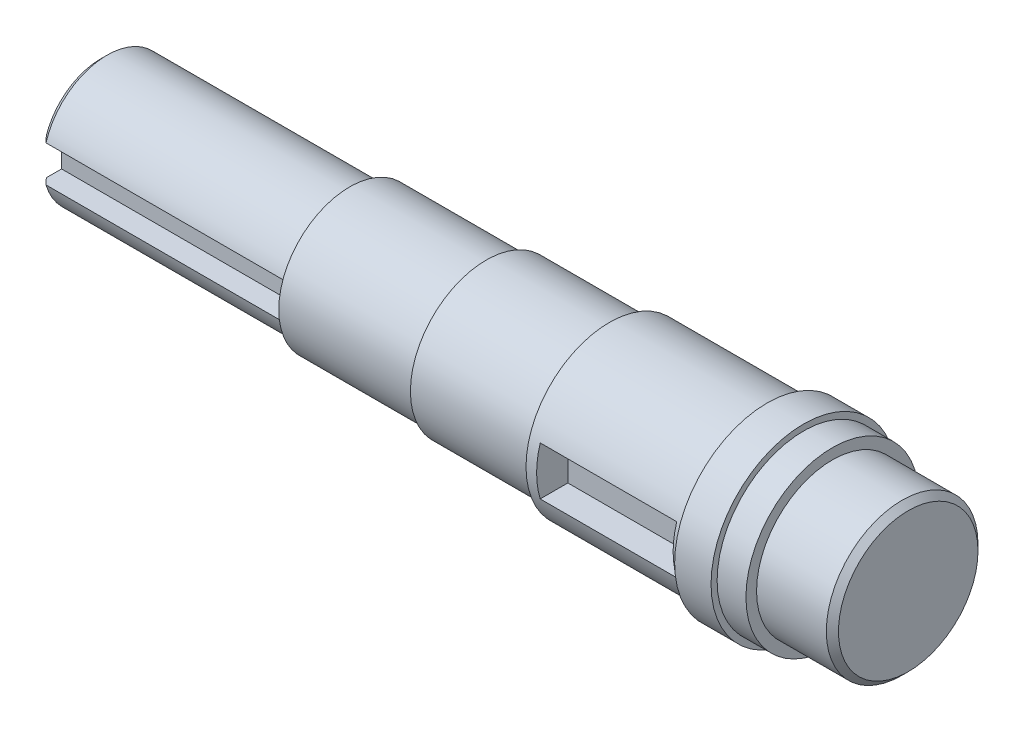
ISO-10303-21;
HEADER;
FILE_DESCRIPTION(('STEP AP214'),'2;1');
FILE_NAME('part.step','',(''),(''),'','','');
FILE_SCHEMA(('AUTOMOTIVE_DESIGN { 1 0 10303 214 1 1 1 1 }'));
ENDSEC;
DATA;
#1=APPLICATION_CONTEXT('core data for automotive mechanical design processes');
#2=APPLICATION_PROTOCOL_DEFINITION('international standard','automotive_design',2000,#1);
#3=PRODUCT_CONTEXT('',#1,'mechanical');
#4=PRODUCT('Part','Part','',(#3));
#5=PRODUCT_RELATED_PRODUCT_CATEGORY('part','',(#4));
#6=PRODUCT_DEFINITION_FORMATION('','',#4);
#7=PRODUCT_DEFINITION_CONTEXT('part definition',#1,'design');
#8=PRODUCT_DEFINITION('design','',#6,#7);
#9=PRODUCT_DEFINITION_SHAPE('','',#8);
#10=(LENGTH_UNIT() NAMED_UNIT(*) SI_UNIT(.MILLI.,.METRE.));
#11=(NAMED_UNIT(*) PLANE_ANGLE_UNIT() SI_UNIT($,.RADIAN.));
#12=(NAMED_UNIT(*) SI_UNIT($,.STERADIAN.) SOLID_ANGLE_UNIT());
#13=UNCERTAINTY_MEASURE_WITH_UNIT(LENGTH_MEASURE(1.E-05),#10,'distance_accuracy_value','');
#14=(GEOMETRIC_REPRESENTATION_CONTEXT(3) GLOBAL_UNCERTAINTY_ASSIGNED_CONTEXT((#13)) GLOBAL_UNIT_ASSIGNED_CONTEXT((#10,
#11,#12)) REPRESENTATION_CONTEXT('',''));
#15=CARTESIAN_POINT('',(0.,0.,0.));
#16=DIRECTION('',(0.,0.,1.));
#17=DIRECTION('',(1.,0.,0.));
#18=AXIS2_PLACEMENT_3D('',#15,#16,#17);
#19=CARTESIAN_POINT('',(16.5341289863676,-50.6842133344205,0.));
#20=DIRECTION('',(-1.,0.,0.));
#21=DIRECTION('',(0.,0.,1.));
#22=AXIS2_PLACEMENT_3D('',#19,#20,#21);
#23=PLANE('',#22);
#24=CARTESIAN_POINT('',(16.5341289863676,-27.2842133344205,0.));
#25=DIRECTION('',(-1.,0.,0.));
#26=DIRECTION('',(0.,0.,1.));
#27=AXIS2_PLACEMENT_3D('',#24,#25,#26);
#28=CIRCLE('',#27,25.);
#29=CARTESIAN_POINT('',(16.5341289863676,-27.2842133344205,25.));
#30=VERTEX_POINT('',#29);
#31=EDGE_CURVE('E198',#30,#30,#28,.T.);
#32=ORIENTED_EDGE('',*,*,#31,.T.);
#33=EDGE_LOOP('',(#32));
#34=FACE_BOUND('',#33,.T.);
#35=CARTESIAN_POINT('',(16.5341289863676,-27.2842133344205,0.));
#36=DIRECTION('',(-1.,0.,0.));
#37=DIRECTION('',(0.,0.,1.));
#38=AXIS2_PLACEMENT_3D('',#35,#36,#37);
#39=CIRCLE('',#38,23.4);
#40=CARTESIAN_POINT('',(16.5341289863676,-27.2842133344205,23.4));
#41=VERTEX_POINT('',#40);
#42=EDGE_CURVE('E165',#41,#41,#39,.T.);
#43=ORIENTED_EDGE('',*,*,#42,.F.);
#44=EDGE_LOOP('',(#43));
#45=FACE_BOUND('',#44,.T.);
#46=ADVANCED_FACE('F35',(#34,#45),#23,.T.);
#47=CARTESIAN_POINT('',(-110.465871013632,-27.2842133344205,0.));
#48=DIRECTION('',(-1.,0.,0.));
#49=DIRECTION('',(0.,0.,1.));
#50=AXIS2_PLACEMENT_3D('',#47,#48,#49);
#51=CYLINDRICAL_SURFACE('',#50,25.);
#52=CARTESIAN_POINT('',(57.1341289863676,-27.2842133344205,0.));
#53=DIRECTION('',(-1.,0.,0.));
#54=DIRECTION('',(0.,0.,1.));
#55=AXIS2_PLACEMENT_3D('',#52,#53,#54);
#56=CIRCLE('',#55,25.);
#57=CARTESIAN_POINT('',(57.1341289863676,-27.2842133344205,25.));
#58=VERTEX_POINT('',#57);
#59=EDGE_CURVE('E195',#58,#58,#56,.T.);
#60=ORIENTED_EDGE('',*,*,#59,.T.);
#61=EDGE_LOOP('',(#60));
#62=FACE_BOUND('',#61,.T.);
#63=ORIENTED_EDGE('',*,*,#31,.F.);
#64=EDGE_LOOP('',(#63));
#65=FACE_BOUND('',#64,.T.);
#66=ADVANCED_FACE('F309',(#62,#65),#51,.T.);
#67=CARTESIAN_POINT('',(57.1341289863676,-52.2842133344205,0.));
#68=DIRECTION('',(-1.,0.,0.));
#69=DIRECTION('',(0.,0.,1.));
#70=AXIS2_PLACEMENT_3D('',#67,#68,#69);
#71=PLANE('',#70);
#72=CARTESIAN_POINT('',(57.1341289863676,-27.2842133344205,0.));
#73=DIRECTION('',(-1.,0.,0.));
#74=DIRECTION('',(0.,0.,1.));
#75=AXIS2_PLACEMENT_3D('',#72,#73,#74);
#76=CIRCLE('',#75,27.5);
#77=CARTESIAN_POINT('',(57.1341289863676,-27.2842133344205,27.5));
#78=VERTEX_POINT('',#77);
#79=EDGE_CURVE('E192',#78,#78,#76,.T.);
#80=ORIENTED_EDGE('',*,*,#79,.T.);
#81=EDGE_LOOP('',(#80));
#82=FACE_BOUND('',#81,.T.);
#83=ORIENTED_EDGE('',*,*,#59,.F.);
#84=EDGE_LOOP('',(#83));
#85=FACE_BOUND('',#84,.T.);
#86=ADVANCED_FACE('F305',(#82,#85),#71,.T.);
#87=CARTESIAN_POINT('',(-110.465871013632,-27.2842133344205,0.));
#88=DIRECTION('',(-1.,0.,0.));
#89=DIRECTION('',(0.,0.,1.));
#90=AXIS2_PLACEMENT_3D('',#87,#88,#89);
#91=CYLINDRICAL_SURFACE('',#90,27.5);
#92=CARTESIAN_POINT('',(60.6341289863676,-27.2842133344205,0.));
#93=DIRECTION('',(-1.,0.,0.));
#94=DIRECTION('',(0.,0.,1.));
#95=AXIS2_PLACEMENT_3D('',#92,#93,#94);
#96=CIRCLE('',#95,27.5);
#97=CARTESIAN_POINT('',(60.6341289863676,-19.2842133344205,26.3106442338457));
#98=VERTEX_POINT('',#97);
#99=CARTESIAN_POINT('',(60.6341289863676,-35.2842133344205,26.3106442338457));
#100=VERTEX_POINT('',#99);
#101=EDGE_CURVE('E209',#98,#100,#96,.F.);
#102=ORIENTED_EDGE('',*,*,#101,.F.);
#103=DIRECTION('',(-1.,0.,0.));
#104=VECTOR('',#103,1.);
#105=CARTESIAN_POINT('',(-110.465871013632,-19.2842133344205,26.3106442338457));
#106=LINE('',#105,#104);
#107=CARTESIAN_POINT('',(105.634128986368,-19.2842133344205,26.3106442338457));
#108=VERTEX_POINT('',#107);
#109=EDGE_CURVE('E201',#108,#98,#106,.T.);
#110=ORIENTED_EDGE('',*,*,#109,.F.);
#111=CARTESIAN_POINT('',(105.634128986368,-27.2842133344205,0.));
#112=DIRECTION('',(-1.,0.,0.));
#113=DIRECTION('',(0.,0.,1.));
#114=AXIS2_PLACEMENT_3D('',#111,#112,#113);
#115=CIRCLE('',#114,27.5);
#116=CARTESIAN_POINT('',(105.634128986368,-35.2842133344205,26.3106442338457));
#117=VERTEX_POINT('',#116);
#118=EDGE_CURVE('E203',#108,#117,#115,.F.);
#119=ORIENTED_EDGE('',*,*,#118,.T.);
#120=DIRECTION('',(-1.,0.,0.));
#121=VECTOR('',#120,1.);
#122=CARTESIAN_POINT('',(-110.465871013632,-35.2842133344205,26.3106442338457));
#123=LINE('',#122,#121);
#124=EDGE_CURVE('E206',#117,#100,#123,.T.);
#125=ORIENTED_EDGE('',*,*,#124,.T.);
#126=EDGE_LOOP('',(#102,#110,#119,#125));
#127=FACE_BOUND('',#126,.T.);
#128=CARTESIAN_POINT('',(109.134128986368,-27.2842133344205,0.));
#129=DIRECTION('',(-1.,0.,0.));
#130=DIRECTION('',(0.,0.,1.));
#131=AXIS2_PLACEMENT_3D('',#128,#129,#130);
#132=CIRCLE('',#131,27.5);
#133=CARTESIAN_POINT('',(109.134128986368,-27.2842133344205,27.5));
#134=VERTEX_POINT('',#133);
#135=EDGE_CURVE('E189',#134,#134,#132,.T.);
#136=ORIENTED_EDGE('',*,*,#135,.T.);
#137=EDGE_LOOP('',(#136));
#138=FACE_BOUND('',#137,.T.);
#139=ORIENTED_EDGE('',*,*,#79,.F.);
#140=EDGE_LOOP('',(#139));
#141=FACE_BOUND('',#140,.T.);
#142=ADVANCED_FACE('F301',(#127,#138,#141),#91,.T.);
#143=CARTESIAN_POINT('',(109.134128986368,-54.7842133344205,0.));
#144=DIRECTION('',(-1.,0.,0.));
#145=DIRECTION('',(0.,0.,1.));
#146=AXIS2_PLACEMENT_3D('',#143,#144,#145);
#147=PLANE('',#146);
#148=CARTESIAN_POINT('',(109.134128986368,-27.2842133344205,0.));
#149=DIRECTION('',(-1.,0.,0.));
#150=DIRECTION('',(0.,0.,1.));
#151=AXIS2_PLACEMENT_3D('',#148,#149,#150);
#152=CIRCLE('',#151,30.5);
#153=CARTESIAN_POINT('',(109.134128986368,-27.2842133344205,30.5));
#154=VERTEX_POINT('',#153);
#155=EDGE_CURVE('E186',#154,#154,#152,.T.);
#156=ORIENTED_EDGE('',*,*,#155,.T.);
#157=EDGE_LOOP('',(#156));
#158=FACE_BOUND('',#157,.T.);
#159=ORIENTED_EDGE('',*,*,#135,.F.);
#160=EDGE_LOOP('',(#159));
#161=FACE_BOUND('',#160,.T.);
#162=ADVANCED_FACE('F297',(#158,#161),#147,.T.);
#163=CARTESIAN_POINT('',(-110.465871013632,-27.2842133344205,0.));
#164=DIRECTION('',(-1.,0.,0.));
#165=DIRECTION('',(0.,0.,1.));
#166=AXIS2_PLACEMENT_3D('',#163,#164,#165);
#167=CYLINDRICAL_SURFACE('',#166,30.5);
#168=CARTESIAN_POINT('',(121.134128986368,-27.2842133344205,0.));
#169=DIRECTION('',(-1.,0.,0.));
#170=DIRECTION('',(0.,0.,1.));
#171=AXIS2_PLACEMENT_3D('',#168,#169,#170);
#172=CIRCLE('',#171,30.5);
#173=CARTESIAN_POINT('',(121.134128986368,-27.2842133344205,30.5));
#174=VERTEX_POINT('',#173);
#175=EDGE_CURVE('E183',#174,#174,#172,.T.);
#176=ORIENTED_EDGE('',*,*,#175,.T.);
#177=EDGE_LOOP('',(#176));
#178=FACE_BOUND('',#177,.T.);
#179=ORIENTED_EDGE('',*,*,#155,.F.);
#180=EDGE_LOOP('',(#179));
#181=FACE_BOUND('',#180,.T.);
#182=ADVANCED_FACE('F293',(#178,#181),#167,.T.);
#183=CARTESIAN_POINT('',(121.134128986368,-57.7842133344205,0.));
#184=DIRECTION('',(1.,0.,0.));
#185=DIRECTION('',(0.,0.,-1.));
#186=AXIS2_PLACEMENT_3D('',#183,#184,#185);
#187=PLANE('',#186);
#188=CARTESIAN_POINT('',(121.134128986368,-27.2842133344205,0.));
#189=DIRECTION('',(-1.,0.,0.));
#190=DIRECTION('',(0.,0.,1.));
#191=AXIS2_PLACEMENT_3D('',#188,#189,#190);
#192=CIRCLE('',#191,28.5);
#193=CARTESIAN_POINT('',(121.134128986368,-27.2842133344205,28.5));
#194=VERTEX_POINT('',#193);
#195=EDGE_CURVE('E180',#194,#194,#192,.T.);
#196=ORIENTED_EDGE('',*,*,#195,.T.);
#197=EDGE_LOOP('',(#196));
#198=FACE_BOUND('',#197,.T.);
#199=ORIENTED_EDGE('',*,*,#175,.F.);
#200=EDGE_LOOP('',(#199));
#201=FACE_BOUND('',#200,.T.);
#202=ADVANCED_FACE('F289',(#198,#201),#187,.T.);
#203=CARTESIAN_POINT('',(-110.465871013632,-27.2842133344205,0.));
#204=DIRECTION('',(-1.,0.,0.));
#205=DIRECTION('',(0.,0.,1.));
#206=AXIS2_PLACEMENT_3D('',#203,#204,#205);
#207=CYLINDRICAL_SURFACE('',#206,28.5);
#208=CARTESIAN_POINT('',(130.634128986368,-27.2842133344205,0.));
#209=DIRECTION('',(-1.,0.,0.));
#210=DIRECTION('',(0.,0.,1.));
#211=AXIS2_PLACEMENT_3D('',#208,#209,#210);
#212=CIRCLE('',#211,28.5);
#213=CARTESIAN_POINT('',(130.634128986368,-27.2842133344205,28.5));
#214=VERTEX_POINT('',#213);
#215=EDGE_CURVE('E177',#214,#214,#212,.T.);
#216=ORIENTED_EDGE('',*,*,#215,.T.);
#217=EDGE_LOOP('',(#216));
#218=FACE_BOUND('',#217,.T.);
#219=ORIENTED_EDGE('',*,*,#195,.F.);
#220=EDGE_LOOP('',(#219));
#221=FACE_BOUND('',#220,.T.);
#222=ADVANCED_FACE('F285',(#218,#221),#207,.T.);
#223=CARTESIAN_POINT('',(130.634128986368,-55.7842133344205,0.));
#224=DIRECTION('',(1.,0.,0.));
#225=DIRECTION('',(0.,0.,-1.));
#226=AXIS2_PLACEMENT_3D('',#223,#224,#225);
#227=PLANE('',#226);
#228=CARTESIAN_POINT('',(130.634128986368,-27.2842133344205,0.));
#229=DIRECTION('',(-1.,0.,0.));
#230=DIRECTION('',(0.,0.,1.));
#231=AXIS2_PLACEMENT_3D('',#228,#229,#230);
#232=CIRCLE('',#231,25.);
#233=CARTESIAN_POINT('',(130.634128986368,-27.2842133344205,25.));
#234=VERTEX_POINT('',#233);
#235=EDGE_CURVE('E174',#234,#234,#232,.T.);
#236=ORIENTED_EDGE('',*,*,#235,.T.);
#237=EDGE_LOOP('',(#236));
#238=FACE_BOUND('',#237,.T.);
#239=ORIENTED_EDGE('',*,*,#215,.F.);
#240=EDGE_LOOP('',(#239));
#241=FACE_BOUND('',#240,.T.);
#242=ADVANCED_FACE('F281',(#238,#241),#227,.T.);
#243=CARTESIAN_POINT('',(-110.465871013632,-27.2842133344205,0.));
#244=DIRECTION('',(-1.,0.,0.));
#245=DIRECTION('',(0.,0.,1.));
#246=AXIS2_PLACEMENT_3D('',#243,#244,#245);
#247=CYLINDRICAL_SURFACE('',#246,25.);
#248=CARTESIAN_POINT('',(153.634128986368,-27.2842133344205,0.));
#249=DIRECTION('',(1.,0.,0.));
#250=DIRECTION('',(0.,0.,-1.));
#251=AXIS2_PLACEMENT_3D('',#248,#249,#250);
#252=CIRCLE('',#251,25.);
#253=CARTESIAN_POINT('',(153.634128986368,-27.2842133344205,-25.));
#254=VERTEX_POINT('',#253);
#255=EDGE_CURVE('E216',#254,#254,#252,.F.);
#256=ORIENTED_EDGE('',*,*,#255,.T.);
#257=EDGE_LOOP('',(#256));
#258=FACE_BOUND('',#257,.T.);
#259=ORIENTED_EDGE('',*,*,#235,.F.);
#260=EDGE_LOOP('',(#259));
#261=FACE_BOUND('',#260,.T.);
#262=ADVANCED_FACE('F277',(#258,#261),#247,.T.);
#263=CARTESIAN_POINT('',(155.634128986368,-27.2842133344205,0.));
#264=DIRECTION('',(1.,0.,0.));
#265=DIRECTION('',(0.,0.,-1.));
#266=AXIS2_PLACEMENT_3D('',#263,#264,#265);
#267=PLANE('',#266);
#268=CARTESIAN_POINT('',(155.634128986368,-27.2842133344205,0.));
#269=DIRECTION('',(1.,0.,0.));
#270=DIRECTION('',(0.,0.,-1.));
#271=AXIS2_PLACEMENT_3D('',#268,#269,#270);
#272=CIRCLE('',#271,23.);
#273=CARTESIAN_POINT('',(155.634128986368,-27.2842133344205,-23.));
#274=VERTEX_POINT('',#273);
#275=EDGE_CURVE('E219',#274,#274,#272,.T.);
#276=ORIENTED_EDGE('',*,*,#275,.T.);
#277=EDGE_LOOP('',(#276));
#278=FACE_BOUND('',#277,.T.);
#279=ADVANCED_FACE('F273',(#278),#267,.T.);
#280=CARTESIAN_POINT('',(-110.465871013632,-27.2842133344205,0.));
#281=DIRECTION('',(-1.,0.,0.));
#282=DIRECTION('',(0.,0.,1.));
#283=AXIS2_PLACEMENT_3D('',#280,#281,#282);
#284=PLANE('',#283);
#285=DIRECTION('',(0.,0.,-1.));
#286=VECTOR('',#285,1.);
#287=CARTESIAN_POINT('',(-110.465871013632,-21.2842133344205,48.));
#288=LINE('',#287,#286);
#289=CARTESIAN_POINT('',(-110.465871013632,-21.2842133344205,18.0277563773199));
#290=VERTEX_POINT('',#289);
#291=CARTESIAN_POINT('',(-110.465871013632,-21.2842133344205,13.));
#292=VERTEX_POINT('',#291);
#293=EDGE_CURVE('E123',#290,#292,#288,.T.);
#294=ORIENTED_EDGE('',*,*,#293,.F.);
#295=CARTESIAN_POINT('',(-110.465871013632,-27.2842133344205,0.));
#296=DIRECTION('',(-1.,0.,0.));
#297=DIRECTION('',(0.,0.,1.));
#298=AXIS2_PLACEMENT_3D('',#295,#296,#297);
#299=CIRCLE('',#298,19.);
#300=CARTESIAN_POINT('',(-110.465871013632,-33.2842133344205,18.0277563773199));
#301=VERTEX_POINT('',#300);
#302=EDGE_CURVE('E222',#290,#301,#299,.T.);
#303=ORIENTED_EDGE('',*,*,#302,.T.);
#304=DIRECTION('',(0.,0.,-1.));
#305=VECTOR('',#304,1.);
#306=CARTESIAN_POINT('',(-110.465871013632,-33.2842133344205,48.));
#307=LINE('',#306,#305);
#308=CARTESIAN_POINT('',(-110.465871013632,-33.2842133344205,13.));
#309=VERTEX_POINT('',#308);
#310=EDGE_CURVE('E143',#301,#309,#307,.T.);
#311=ORIENTED_EDGE('',*,*,#310,.T.);
#312=DIRECTION('',(0.,1.,0.));
#313=VECTOR('',#312,1.);
#314=CARTESIAN_POINT('',(-110.465871013632,0.,13.));
#315=LINE('',#314,#313);
#316=EDGE_CURVE('E136',#309,#292,#315,.T.);
#317=ORIENTED_EDGE('',*,*,#316,.T.);
#318=EDGE_LOOP('',(#294,#303,#311,#317));
#319=FACE_BOUND('',#318,.T.);
#320=ADVANCED_FACE('F270',(#319),#284,.T.);
#321=CARTESIAN_POINT('',(-110.465871013632,-27.2842133344205,0.));
#322=DIRECTION('',(-1.,0.,0.));
#323=DIRECTION('',(0.,0.,1.));
#324=AXIS2_PLACEMENT_3D('',#321,#322,#323);
#325=CYLINDRICAL_SURFACE('',#324,21.);
#326=DIRECTION('',(-1.,0.,0.));
#327=VECTOR('',#326,1.);
#328=CARTESIAN_POINT('',(-110.465871013632,-33.2842133344205,20.1246117974981));
#329=LINE('',#328,#327);
#330=CARTESIAN_POINT('',(-108.465871013632,-33.2842133344205,20.1246117974981));
#331=VERTEX_POINT('',#330);
#332=CARTESIAN_POINT('',(-29.4658710136323,-33.2842133344205,20.1246117974981));
#333=VERTEX_POINT('',#332);
#334=EDGE_CURVE('E211',#331,#333,#329,.F.);
#335=ORIENTED_EDGE('',*,*,#334,.F.);
#336=CARTESIAN_POINT('',(-108.465871013632,-27.2842133344205,0.));
#337=DIRECTION('',(-1.,0.,0.));
#338=DIRECTION('',(0.,0.,1.));
#339=AXIS2_PLACEMENT_3D('',#336,#337,#338);
#340=CIRCLE('',#339,21.);
#341=CARTESIAN_POINT('',(-108.465871013632,-21.2842133344205,20.1246117974981));
#342=VERTEX_POINT('',#341);
#343=EDGE_CURVE('E50',#331,#342,#340,.F.);
#344=ORIENTED_EDGE('',*,*,#343,.T.);
#345=DIRECTION('',(-1.,0.,0.));
#346=VECTOR('',#345,1.);
#347=CARTESIAN_POINT('',(-110.465871013632,-21.2842133344205,20.1246117974981));
#348=LINE('',#347,#346);
#349=CARTESIAN_POINT('',(-29.4658710136323,-21.2842133344205,20.1246117974981));
#350=VERTEX_POINT('',#349);
#351=EDGE_CURVE('E214',#350,#342,#348,.T.);
#352=ORIENTED_EDGE('',*,*,#351,.F.);
#353=CARTESIAN_POINT('',(-29.4658710136323,-27.2842133344205,0.));
#354=DIRECTION('',(1.,0.,0.));
#355=DIRECTION('',(0.,0.,-1.));
#356=AXIS2_PLACEMENT_3D('',#353,#354,#355);
#357=CIRCLE('',#356,21.);
#358=EDGE_CURVE('E119',#333,#350,#357,.F.);
#359=ORIENTED_EDGE('',*,*,#358,.F.);
#360=EDGE_LOOP('',(#335,#344,#352,#359));
#361=FACE_BOUND('',#360,.T.);
#362=CARTESIAN_POINT('',(-28.4658710136323,-27.2842133344205,0.));
#363=DIRECTION('',(-1.,0.,0.));
#364=DIRECTION('',(0.,0.,1.));
#365=AXIS2_PLACEMENT_3D('',#362,#363,#364);
#366=CIRCLE('',#365,21.);
#367=CARTESIAN_POINT('',(-28.4658710136323,-27.2842133344205,21.));
#368=VERTEX_POINT('',#367);
#369=EDGE_CURVE('E171',#368,#368,#366,.T.);
#370=ORIENTED_EDGE('',*,*,#369,.T.);
#371=EDGE_LOOP('',(#370));
#372=FACE_BOUND('',#371,.T.);
#373=ADVANCED_FACE('F266',(#361,#372),#325,.T.);
#374=CARTESIAN_POINT('',(-28.4658710136323,-48.2842133344205,0.));
#375=DIRECTION('',(-1.,0.,0.));
#376=DIRECTION('',(0.,0.,1.));
#377=AXIS2_PLACEMENT_3D('',#374,#375,#376);
#378=PLANE('',#377);
#379=CARTESIAN_POINT('',(-28.4658710136323,-27.2842133344205,0.));
#380=DIRECTION('',(-1.,0.,0.));
#381=DIRECTION('',(0.,0.,1.));
#382=AXIS2_PLACEMENT_3D('',#379,#380,#381);
#383=CIRCLE('',#382,23.4);
#384=CARTESIAN_POINT('',(-28.4658710136323,-27.2842133344205,23.4));
#385=VERTEX_POINT('',#384);
#386=EDGE_CURVE('E168',#385,#385,#383,.T.);
#387=ORIENTED_EDGE('',*,*,#386,.T.);
#388=EDGE_LOOP('',(#387));
#389=FACE_BOUND('',#388,.T.);
#390=ORIENTED_EDGE('',*,*,#369,.F.);
#391=EDGE_LOOP('',(#390));
#392=FACE_BOUND('',#391,.T.);
#393=ADVANCED_FACE('F262',(#389,#392),#378,.T.);
#394=CARTESIAN_POINT('',(-110.465871013632,-27.2842133344205,0.));
#395=DIRECTION('',(-1.,0.,0.));
#396=DIRECTION('',(0.,0.,1.));
#397=AXIS2_PLACEMENT_3D('',#394,#395,#396);
#398=CYLINDRICAL_SURFACE('',#397,23.4);
#399=ORIENTED_EDGE('',*,*,#42,.T.);
#400=EDGE_LOOP('',(#399));
#401=FACE_BOUND('',#400,.T.);
#402=ORIENTED_EDGE('',*,*,#386,.F.);
#403=EDGE_LOOP('',(#402));
#404=FACE_BOUND('',#403,.T.);
#405=ADVANCED_FACE('F258',(#401,#404),#398,.T.);
#406=CARTESIAN_POINT('',(60.6341289863676,0.,53.2));
#407=DIRECTION('',(-1.,0.,0.));
#408=DIRECTION('',(0.,0.,1.));
#409=AXIS2_PLACEMENT_3D('',#406,#407,#408);
#410=PLANE('',#409);
#411=ORIENTED_EDGE('',*,*,#101,.T.);
#412=DIRECTION('',(0.,0.,-1.));
#413=VECTOR('',#412,1.);
#414=CARTESIAN_POINT('',(60.6341289863676,-35.2842133344205,53.2));
#415=LINE('',#414,#413);
#416=CARTESIAN_POINT('',(60.6341289863676,-35.2842133344205,17.2));
#417=VERTEX_POINT('',#416);
#418=EDGE_CURVE('E163',#100,#417,#415,.T.);
#419=ORIENTED_EDGE('',*,*,#418,.T.);
#420=DIRECTION('',(0.,1.,0.));
#421=VECTOR('',#420,1.);
#422=CARTESIAN_POINT('',(60.6341289863676,0.,17.2));
#423=LINE('',#422,#421);
#424=CARTESIAN_POINT('',(60.6341289863676,-19.2842133344205,17.2));
#425=VERTEX_POINT('',#424);
#426=EDGE_CURVE('E122',#417,#425,#423,.T.);
#427=ORIENTED_EDGE('',*,*,#426,.T.);
#428=DIRECTION('',(0.,0.,-1.));
#429=VECTOR('',#428,1.);
#430=CARTESIAN_POINT('',(60.6341289863676,-19.2842133344205,53.2));
#431=LINE('',#430,#429);
#432=EDGE_CURVE('E157',#98,#425,#431,.T.);
#433=ORIENTED_EDGE('',*,*,#432,.F.);
#434=EDGE_LOOP('',(#411,#419,#427,#433));
#435=FACE_BOUND('',#434,.T.);
#436=ADVANCED_FACE('F254',(#435),#410,.F.);
#437=CARTESIAN_POINT('',(0.,-35.2842133344205,53.2));
#438=DIRECTION('',(0.,1.,0.));
#439=DIRECTION('',(0.,0.,1.));
#440=AXIS2_PLACEMENT_3D('',#437,#438,#439);
#441=PLANE('',#440);
#442=DIRECTION('',(0.,0.,-1.));
#443=VECTOR('',#442,1.);
#444=CARTESIAN_POINT('',(105.634128986368,-35.2842133344205,53.2));
#445=LINE('',#444,#443);
#446=CARTESIAN_POINT('',(105.634128986368,-35.2842133344205,17.2));
#447=VERTEX_POINT('',#446);
#448=EDGE_CURVE('E161',#117,#447,#445,.T.);
#449=ORIENTED_EDGE('',*,*,#448,.T.);
#450=DIRECTION('',(1.,0.,0.));
#451=VECTOR('',#450,1.);
#452=CARTESIAN_POINT('',(0.,-35.2842133344205,17.2));
#453=LINE('',#452,#451);
#454=EDGE_CURVE('E148',#417,#447,#453,.T.);
#455=ORIENTED_EDGE('',*,*,#454,.F.);
#456=ORIENTED_EDGE('',*,*,#418,.F.);
#457=ORIENTED_EDGE('',*,*,#124,.F.);
#458=EDGE_LOOP('',(#449,#455,#456,#457));
#459=FACE_BOUND('',#458,.T.);
#460=ADVANCED_FACE('F250',(#459),#441,.T.);
#461=CARTESIAN_POINT('',(105.634128986368,0.,53.2));
#462=DIRECTION('',(-1.,0.,0.));
#463=DIRECTION('',(0.,0.,1.));
#464=AXIS2_PLACEMENT_3D('',#461,#462,#463);
#465=PLANE('',#464);
#466=DIRECTION('',(0.,0.,-1.));
#467=VECTOR('',#466,1.);
#468=CARTESIAN_POINT('',(105.634128986368,-19.2842133344205,53.2));
#469=LINE('',#468,#467);
#470=CARTESIAN_POINT('',(105.634128986368,-19.2842133344205,17.2));
#471=VERTEX_POINT('',#470);
#472=EDGE_CURVE('E159',#108,#471,#469,.T.);
#473=ORIENTED_EDGE('',*,*,#472,.T.);
#474=DIRECTION('',(0.,1.,0.));
#475=VECTOR('',#474,1.);
#476=CARTESIAN_POINT('',(105.634128986368,0.,17.2));
#477=LINE('',#476,#475);
#478=EDGE_CURVE('E151',#447,#471,#477,.T.);
#479=ORIENTED_EDGE('',*,*,#478,.F.);
#480=ORIENTED_EDGE('',*,*,#448,.F.);
#481=ORIENTED_EDGE('',*,*,#118,.F.);
#482=EDGE_LOOP('',(#473,#479,#480,#481));
#483=FACE_BOUND('',#482,.T.);
#484=ADVANCED_FACE('F246',(#483),#465,.T.);
#485=CARTESIAN_POINT('',(0.,-19.2842133344205,53.2));
#486=DIRECTION('',(0.,1.,0.));
#487=DIRECTION('',(-1.,0.,0.));
#488=AXIS2_PLACEMENT_3D('',#485,#486,#487);
#489=PLANE('',#488);
#490=ORIENTED_EDGE('',*,*,#109,.T.);
#491=ORIENTED_EDGE('',*,*,#432,.T.);
#492=DIRECTION('',(1.,0.,0.));
#493=VECTOR('',#492,1.);
#494=CARTESIAN_POINT('',(0.,-19.2842133344205,17.2));
#495=LINE('',#494,#493);
#496=EDGE_CURVE('E154',#425,#471,#495,.T.);
#497=ORIENTED_EDGE('',*,*,#496,.T.);
#498=ORIENTED_EDGE('',*,*,#472,.F.);
#499=EDGE_LOOP('',(#490,#491,#497,#498));
#500=FACE_BOUND('',#499,.T.);
#501=ADVANCED_FACE('F242',(#500),#489,.F.);
#502=CARTESIAN_POINT('',(0.,0.,17.2));
#503=DIRECTION('',(0.,0.,1.));
#504=DIRECTION('',(1.,0.,0.));
#505=AXIS2_PLACEMENT_3D('',#502,#503,#504);
#506=PLANE('',#505);
#507=ORIENTED_EDGE('',*,*,#426,.F.);
#508=ORIENTED_EDGE('',*,*,#454,.T.);
#509=ORIENTED_EDGE('',*,*,#478,.T.);
#510=ORIENTED_EDGE('',*,*,#496,.F.);
#511=EDGE_LOOP('',(#507,#508,#509,#510));
#512=FACE_BOUND('',#511,.T.);
#513=ADVANCED_FACE('F239',(#512),#506,.T.);
#514=CARTESIAN_POINT('',(-29.4658710136323,0.,48.));
#515=DIRECTION('',(1.,0.,0.));
#516=DIRECTION('',(0.,0.,-1.));
#517=AXIS2_PLACEMENT_3D('',#514,#515,#516);
#518=PLANE('',#517);
#519=ORIENTED_EDGE('',*,*,#358,.T.);
#520=DIRECTION('',(0.,0.,-1.));
#521=VECTOR('',#520,1.);
#522=CARTESIAN_POINT('',(-29.4658710136323,-21.2842133344205,48.));
#523=LINE('',#522,#521);
#524=CARTESIAN_POINT('',(-29.4658710136323,-21.2842133344205,13.));
#525=VERTEX_POINT('',#524);
#526=EDGE_CURVE('E112',#350,#525,#523,.T.);
#527=ORIENTED_EDGE('',*,*,#526,.T.);
#528=DIRECTION('',(0.,-1.,0.));
#529=VECTOR('',#528,1.);
#530=CARTESIAN_POINT('',(-29.4658710136323,0.,13.));
#531=LINE('',#530,#529);
#532=CARTESIAN_POINT('',(-29.4658710136323,-33.2842133344205,13.));
#533=VERTEX_POINT('',#532);
#534=EDGE_CURVE('E116',#525,#533,#531,.T.);
#535=ORIENTED_EDGE('',*,*,#534,.T.);
#536=DIRECTION('',(0.,0.,-1.));
#537=VECTOR('',#536,1.);
#538=CARTESIAN_POINT('',(-29.4658710136323,-33.2842133344205,48.));
#539=LINE('',#538,#537);
#540=EDGE_CURVE('E141',#333,#533,#539,.T.);
#541=ORIENTED_EDGE('',*,*,#540,.F.);
#542=EDGE_LOOP('',(#519,#527,#535,#541));
#543=FACE_BOUND('',#542,.T.);
#544=ADVANCED_FACE('F114',(#543),#518,.F.);
#545=CARTESIAN_POINT('',(0.,-21.2842133344205,48.));
#546=DIRECTION('',(0.,1.,0.));
#547=DIRECTION('',(0.,0.,1.));
#548=AXIS2_PLACEMENT_3D('',#545,#546,#547);
#549=PLANE('',#548);
#550=ORIENTED_EDGE('',*,*,#351,.T.);
#551=CARTESIAN_POINT('',(-108.465871013632,-21.2842133344205,20.1246117974981));
#552=CARTESIAN_POINT('',(-108.632948566604,-21.2842133344205,19.9502661359722));
#553=CARTESIAN_POINT('',(-108.799934247408,-21.2842133344205,19.7758323982631));
#554=CARTESIAN_POINT('',(-109.133705720391,-21.2842133344205,19.4267743068857));
#555=CARTESIAN_POINT('',(-109.300491512877,-21.2842133344205,19.2521499535104));
#556=CARTESIAN_POINT('',(-109.633847613769,-21.2842133344205,18.9026955945248));
#557=CARTESIAN_POINT('',(-109.800417922128,-21.2842133344205,18.7278655888707));
#558=CARTESIAN_POINT('',(-110.133324627588,-21.2842133344205,18.3779825115447));
#559=CARTESIAN_POINT('',(-110.299661024329,-21.2842133344205,18.2029294395307));
#560=CARTESIAN_POINT('',(-110.465871013632,-21.2842133344205,18.0277563773199));
#561=B_SPLINE_CURVE_WITH_KNOTS('',3,(#551,#552,#553,#554,#555,#556,#557,#558,#559,#560),
.UNSPECIFIED.,.F.,.F.,(4,2,2,2,4),(0.,0.724432100313236,1.44886308820616,2.17329423087595,
2.89772648625807),.UNSPECIFIED.);
#562=EDGE_CURVE('E11',#342,#290,#561,.T.);
#563=ORIENTED_EDGE('',*,*,#562,.T.);
#564=ORIENTED_EDGE('',*,*,#293,.T.);
#565=DIRECTION('',(1.,0.,0.));
#566=VECTOR('',#565,1.);
#567=CARTESIAN_POINT('',(0.,-21.2842133344205,13.));
#568=LINE('',#567,#566);
#569=EDGE_CURVE('E129',#292,#525,#568,.T.);
#570=ORIENTED_EDGE('',*,*,#569,.T.);
#571=ORIENTED_EDGE('',*,*,#526,.F.);
#572=EDGE_LOOP('',(#550,#563,#564,#570,#571));
#573=FACE_BOUND('',#572,.T.);
#574=ADVANCED_FACE('F134',(#573),#549,.F.);
#575=CARTESIAN_POINT('',(0.,-33.2842133344205,48.));
#576=DIRECTION('',(0.,-1.,0.));
#577=DIRECTION('',(1.,0.,0.));
#578=AXIS2_PLACEMENT_3D('',#575,#576,#577);
#579=PLANE('',#578);
#580=ORIENTED_EDGE('',*,*,#310,.F.);
#581=CARTESIAN_POINT('',(-110.465871013632,-33.2842133344205,18.0277563773199));
#582=CARTESIAN_POINT('',(-110.299661024329,-33.2842133344205,18.2029294395308));
#583=CARTESIAN_POINT('',(-110.133324627588,-33.2842133344205,18.3779825115447));
#584=CARTESIAN_POINT('',(-109.800417922128,-33.2842133344205,18.7278655888707));
#585=CARTESIAN_POINT('',(-109.633847613769,-33.2842133344205,18.9026955945248));
#586=CARTESIAN_POINT('',(-109.300491512877,-33.2842133344205,19.2521499535104));
#587=CARTESIAN_POINT('',(-109.133705720391,-33.2842133344205,19.4267743068857));
#588=CARTESIAN_POINT('',(-108.799934247408,-33.2842133344205,19.7758323982631));
#589=CARTESIAN_POINT('',(-108.632948566604,-33.2842133344205,19.9502661359722));
#590=CARTESIAN_POINT('',(-108.465871013632,-33.2842133344205,20.1246117974981));
#591=B_SPLINE_CURVE_WITH_KNOTS('',3,(#581,#582,#583,#584,#585,#586,#587,#588,#589,#590),
.UNSPECIFIED.,.F.,.F.,(4,2,2,2,4),(0.,0.724432255382131,1.44886339805191,2.17329438594484,
2.89772648625807),.UNSPECIFIED.);
#592=EDGE_CURVE('E64',#301,#331,#591,.T.);
#593=ORIENTED_EDGE('',*,*,#592,.T.);
#594=ORIENTED_EDGE('',*,*,#334,.T.);
#595=ORIENTED_EDGE('',*,*,#540,.T.);
#596=DIRECTION('',(-1.,0.,0.));
#597=VECTOR('',#596,1.);
#598=CARTESIAN_POINT('',(0.,-33.2842133344205,13.));
#599=LINE('',#598,#597);
#600=EDGE_CURVE('E132',#533,#309,#599,.T.);
#601=ORIENTED_EDGE('',*,*,#600,.T.);
#602=EDGE_LOOP('',(#580,#593,#594,#595,#601));
#603=FACE_BOUND('',#602,.T.);
#604=ADVANCED_FACE('F230',(#603),#579,.F.);
#605=CARTESIAN_POINT('',(0.,0.,13.));
#606=DIRECTION('',(0.,0.,1.));
#607=DIRECTION('',(1.,0.,0.));
#608=AXIS2_PLACEMENT_3D('',#605,#606,#607);
#609=PLANE('',#608);
#610=ORIENTED_EDGE('',*,*,#534,.F.);
#611=ORIENTED_EDGE('',*,*,#569,.F.);
#612=ORIENTED_EDGE('',*,*,#316,.F.);
#613=ORIENTED_EDGE('',*,*,#600,.F.);
#614=EDGE_LOOP('',(#610,#611,#612,#613));
#615=FACE_BOUND('',#614,.T.);
#616=ADVANCED_FACE('F127',(#615),#609,.T.);
#617=CARTESIAN_POINT('',(153.634128986368,-27.2842133344205,0.));
#618=DIRECTION('',(-1.,0.,0.));
#619=DIRECTION('',(0.,0.,1.));
#620=AXIS2_PLACEMENT_3D('',#617,#618,#619);
#621=CONICAL_SURFACE('',#620,25.,0.785398163397441);
#622=ORIENTED_EDGE('',*,*,#275,.F.);
#623=EDGE_LOOP('',(#622));
#624=FACE_BOUND('',#623,.T.);
#625=ORIENTED_EDGE('',*,*,#255,.F.);
#626=EDGE_LOOP('',(#625));
#627=FACE_BOUND('',#626,.T.);
#628=ADVANCED_FACE('F317',(#624,#627),#621,.T.);
#629=CARTESIAN_POINT('',(-110.465871013632,-27.2842133344205,0.));
#630=DIRECTION('',(1.,0.,0.));
#631=DIRECTION('',(0.,0.,-1.));
#632=AXIS2_PLACEMENT_3D('',#629,#630,#631);
#633=CONICAL_SURFACE('',#632,19.,0.785398163397441);
#634=ORIENTED_EDGE('',*,*,#562,.F.);
#635=ORIENTED_EDGE('',*,*,#343,.F.);
#636=ORIENTED_EDGE('',*,*,#592,.F.);
#637=ORIENTED_EDGE('',*,*,#302,.F.);
#638=EDGE_LOOP('',(#634,#635,#636,#637));
#639=FACE_BOUND('',#638,.T.);
#640=ADVANCED_FACE('F38',(#639),#633,.T.);
#641=CLOSED_SHELL('',(#46,#66,#86,#142,#162,#182,#202,#222,#242,#262,#279,#320,#373,#393,#405,
#436,#460,#484,#501,#513,#544,#574,#604,#616,#628,#640));
#642=MANIFOLD_SOLID_BREP('B2',#641);
#643=ADVANCED_BREP_SHAPE_REPRESENTATION('',(#18,#642),#14);
#644=SHAPE_DEFINITION_REPRESENTATION(#9,#643);
ENDSEC;
END-ISO-10303-21;
